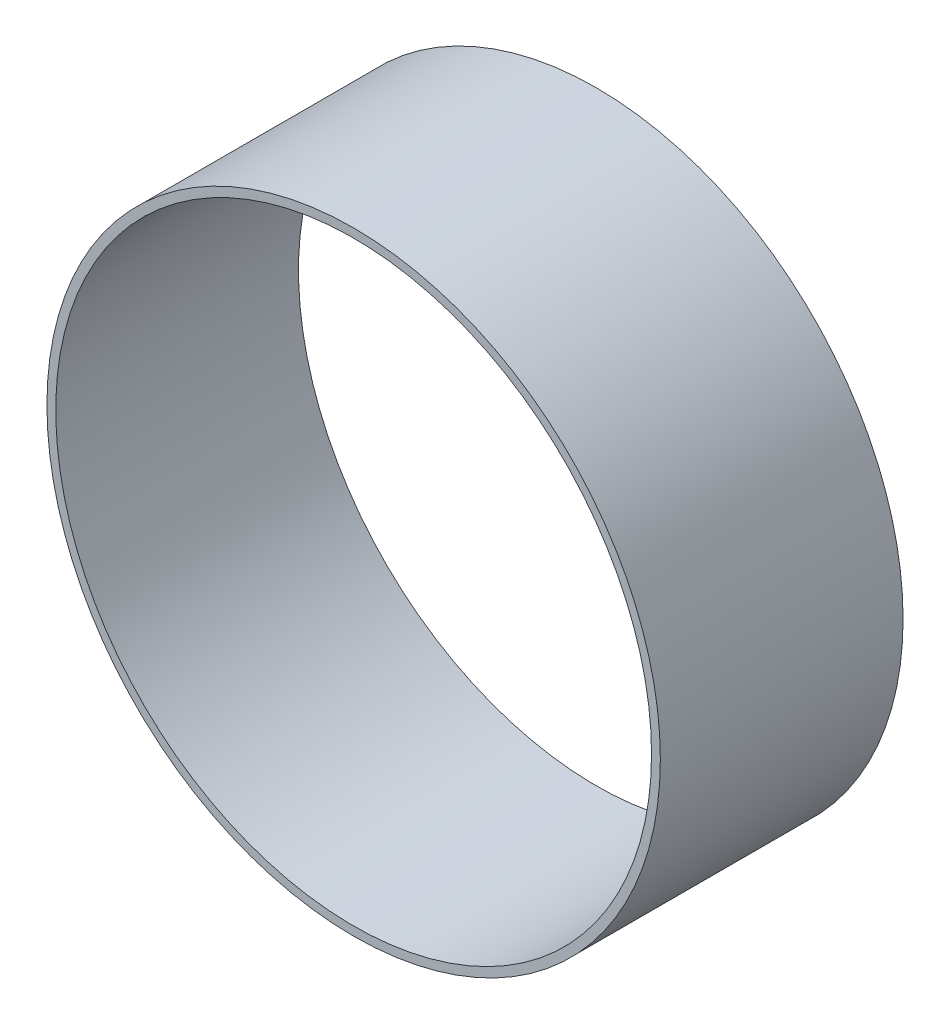
ISO-10303-21;
HEADER;
FILE_DESCRIPTION(('STEP AP214'),'2;1');
FILE_NAME('part.step','',(''),(''),'','','');
FILE_SCHEMA(('AUTOMOTIVE_DESIGN { 1 0 10303 214 1 1 1 1 }'));
ENDSEC;
DATA;
#1=APPLICATION_CONTEXT('core data for automotive mechanical design processes');
#2=APPLICATION_PROTOCOL_DEFINITION('international standard','automotive_design',2000,#1);
#3=PRODUCT_CONTEXT('',#1,'mechanical');
#4=PRODUCT('Part','Part','',(#3));
#5=PRODUCT_RELATED_PRODUCT_CATEGORY('part','',(#4));
#6=PRODUCT_DEFINITION_FORMATION('','',#4);
#7=PRODUCT_DEFINITION_CONTEXT('part definition',#1,'design');
#8=PRODUCT_DEFINITION('design','',#6,#7);
#9=PRODUCT_DEFINITION_SHAPE('','',#8);
#10=(LENGTH_UNIT() NAMED_UNIT(*) SI_UNIT(.MILLI.,.METRE.));
#11=(NAMED_UNIT(*) PLANE_ANGLE_UNIT() SI_UNIT($,.RADIAN.));
#12=(NAMED_UNIT(*) SI_UNIT($,.STERADIAN.) SOLID_ANGLE_UNIT());
#13=UNCERTAINTY_MEASURE_WITH_UNIT(LENGTH_MEASURE(1.E-05),#10,'distance_accuracy_value','');
#14=(GEOMETRIC_REPRESENTATION_CONTEXT(3) GLOBAL_UNCERTAINTY_ASSIGNED_CONTEXT((#13)) GLOBAL_UNIT_ASSIGNED_CONTEXT((#10,
#11,#12)) REPRESENTATION_CONTEXT('',''));
#15=CARTESIAN_POINT('',(0.,0.,0.));
#16=DIRECTION('',(0.,0.,1.));
#17=DIRECTION('',(1.,0.,0.));
#18=AXIS2_PLACEMENT_3D('',#15,#16,#17);
#19=CARTESIAN_POINT('',(0.,0.,28.));
#20=DIRECTION('',(0.,0.,1.));
#21=DIRECTION('',(1.,0.,0.));
#22=AXIS2_PLACEMENT_3D('',#19,#20,#21);
#23=PLANE('',#22);
#24=CARTESIAN_POINT('',(0.,0.,28.));
#25=DIRECTION('',(0.,0.,1.));
#26=DIRECTION('',(1.,0.,0.));
#27=AXIS2_PLACEMENT_3D('',#24,#25,#26);
#28=CIRCLE('',#27,69.5);
#29=CARTESIAN_POINT('',(69.5,0.,28.));
#30=VERTEX_POINT('',#29);
#31=EDGE_CURVE('E10',#30,#30,#28,.T.);
#32=ORIENTED_EDGE('',*,*,#31,.T.);
#33=EDGE_LOOP('',(#32));
#34=FACE_BOUND('',#33,.T.);
#35=CARTESIAN_POINT('',(0.,0.,28.));
#36=DIRECTION('',(0.,0.,1.));
#37=DIRECTION('',(1.,0.,0.));
#38=AXIS2_PLACEMENT_3D('',#35,#36,#37);
#39=CIRCLE('',#38,67.5);
#40=CARTESIAN_POINT('',(67.5,0.,28.));
#41=VERTEX_POINT('',#40);
#42=EDGE_CURVE('E50',#41,#41,#39,.T.);
#43=ORIENTED_EDGE('',*,*,#42,.F.);
#44=EDGE_LOOP('',(#43));
#45=FACE_BOUND('',#44,.T.);
#46=ADVANCED_FACE('F36',(#34,#45),#23,.T.);
#47=CARTESIAN_POINT('',(0.,0.,-27.));
#48=DIRECTION('',(0.,0.,1.));
#49=DIRECTION('',(1.,0.,0.));
#50=AXIS2_PLACEMENT_3D('',#47,#48,#49);
#51=PLANE('',#50);
#52=CARTESIAN_POINT('',(0.,0.,-27.));
#53=DIRECTION('',(0.,0.,1.));
#54=DIRECTION('',(1.,0.,0.));
#55=AXIS2_PLACEMENT_3D('',#52,#53,#54);
#56=CIRCLE('',#55,69.5);
#57=CARTESIAN_POINT('',(69.5,0.,-27.));
#58=VERTEX_POINT('',#57);
#59=EDGE_CURVE('E40',#58,#58,#56,.T.);
#60=ORIENTED_EDGE('',*,*,#59,.F.);
#61=EDGE_LOOP('',(#60));
#62=FACE_BOUND('',#61,.T.);
#63=CARTESIAN_POINT('',(0.,0.,-27.));
#64=DIRECTION('',(0.,0.,1.));
#65=DIRECTION('',(1.,0.,0.));
#66=AXIS2_PLACEMENT_3D('',#63,#64,#65);
#67=CIRCLE('',#66,67.5);
#68=CARTESIAN_POINT('',(67.5,0.,-27.));
#69=VERTEX_POINT('',#68);
#70=EDGE_CURVE('E52',#69,#69,#67,.T.);
#71=ORIENTED_EDGE('',*,*,#70,.T.);
#72=EDGE_LOOP('',(#71));
#73=FACE_BOUND('',#72,.T.);
#74=ADVANCED_FACE('F63',(#62,#73),#51,.F.);
#75=CARTESIAN_POINT('',(0.,0.,28.));
#76=DIRECTION('',(0.,0.,-1.));
#77=DIRECTION('',(-1.,0.,0.));
#78=AXIS2_PLACEMENT_3D('',#75,#76,#77);
#79=CYLINDRICAL_SURFACE('',#78,69.5);
#80=ORIENTED_EDGE('',*,*,#31,.F.);
#81=EDGE_LOOP('',(#80));
#82=FACE_BOUND('',#81,.T.);
#83=ORIENTED_EDGE('',*,*,#59,.T.);
#84=EDGE_LOOP('',(#83));
#85=FACE_BOUND('',#84,.T.);
#86=ADVANCED_FACE('F38',(#82,#85),#79,.T.);
#87=CARTESIAN_POINT('',(0.,0.,28.));
#88=DIRECTION('',(0.,0.,-1.));
#89=DIRECTION('',(-1.,0.,0.));
#90=AXIS2_PLACEMENT_3D('',#87,#88,#89);
#91=CYLINDRICAL_SURFACE('',#90,67.5);
#92=ORIENTED_EDGE('',*,*,#42,.T.);
#93=EDGE_LOOP('',(#92));
#94=FACE_BOUND('',#93,.T.);
#95=ORIENTED_EDGE('',*,*,#70,.F.);
#96=EDGE_LOOP('',(#95));
#97=FACE_BOUND('',#96,.T.);
#98=ADVANCED_FACE('F59',(#94,#97),#91,.F.);
#99=CLOSED_SHELL('',(#46,#74,#86,#98));
#100=MANIFOLD_SOLID_BREP('B2',#99);
#101=ADVANCED_BREP_SHAPE_REPRESENTATION('',(#18,#100),#14);
#102=SHAPE_DEFINITION_REPRESENTATION(#9,#101);
ENDSEC;
END-ISO-10303-21;
